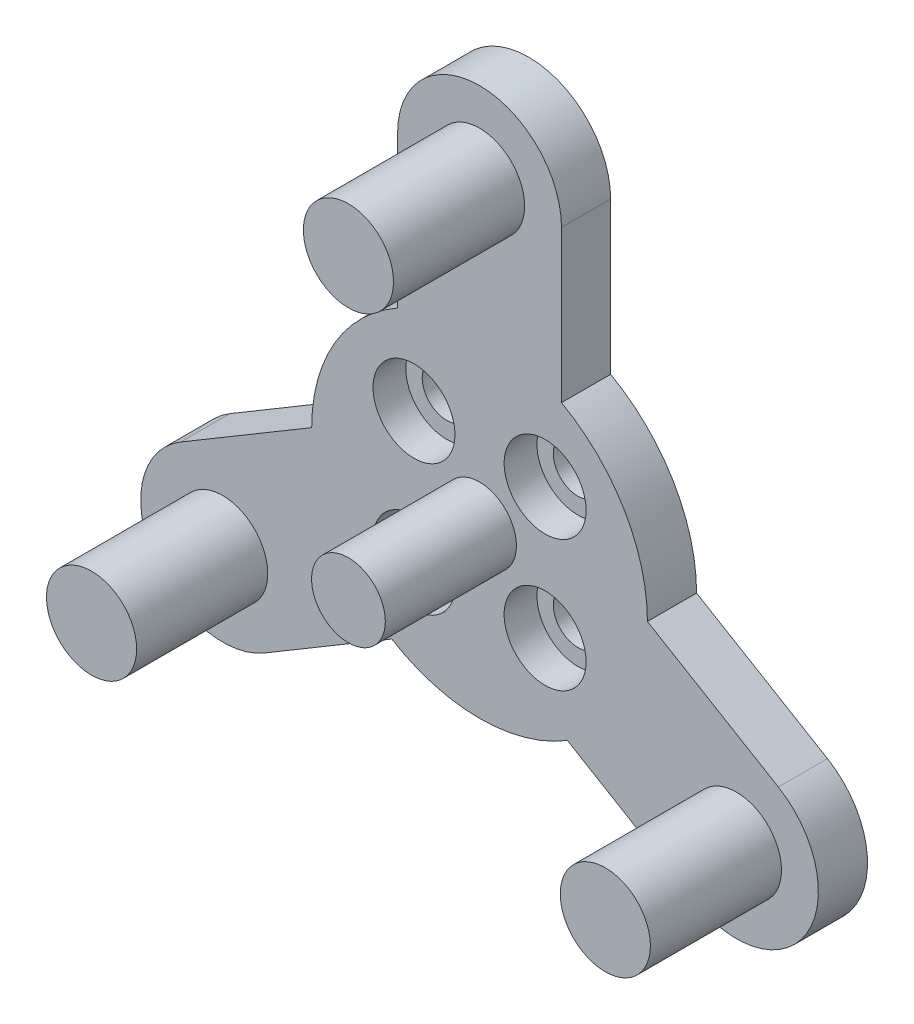
ISO-10303-21;
HEADER;
FILE_DESCRIPTION(('STEP AP214'),'2;1');
FILE_NAME('part.step','',(''),(''),'','','');
FILE_SCHEMA(('AUTOMOTIVE_DESIGN { 1 0 10303 214 1 1 1 1 }'));
ENDSEC;
DATA;
#1=APPLICATION_CONTEXT('core data for automotive mechanical design processes');
#2=APPLICATION_PROTOCOL_DEFINITION('international standard','automotive_design',2000,#1);
#3=PRODUCT_CONTEXT('',#1,'mechanical');
#4=PRODUCT('Part','Part','',(#3));
#5=PRODUCT_RELATED_PRODUCT_CATEGORY('part','',(#4));
#6=PRODUCT_DEFINITION_FORMATION('','',#4);
#7=PRODUCT_DEFINITION_CONTEXT('part definition',#1,'design');
#8=PRODUCT_DEFINITION('design','',#6,#7);
#9=PRODUCT_DEFINITION_SHAPE('','',#8);
#10=(LENGTH_UNIT() NAMED_UNIT(*) SI_UNIT(.MILLI.,.METRE.));
#11=(NAMED_UNIT(*) PLANE_ANGLE_UNIT() SI_UNIT($,.RADIAN.));
#12=(NAMED_UNIT(*) SI_UNIT($,.STERADIAN.) SOLID_ANGLE_UNIT());
#13=UNCERTAINTY_MEASURE_WITH_UNIT(LENGTH_MEASURE(1.E-05),#10,'distance_accuracy_value','');
#14=(GEOMETRIC_REPRESENTATION_CONTEXT(3) GLOBAL_UNCERTAINTY_ASSIGNED_CONTEXT((#13)) GLOBAL_UNIT_ASSIGNED_CONTEXT((#10,
#11,#12)) REPRESENTATION_CONTEXT('',''));
#15=CARTESIAN_POINT('',(0.,0.,0.));
#16=DIRECTION('',(0.,0.,1.));
#17=DIRECTION('',(1.,0.,0.));
#18=AXIS2_PLACEMENT_3D('',#15,#16,#17);
#19=CARTESIAN_POINT('',(4.,4.,10.));
#20=DIRECTION('',(0.,0.,-1.));
#21=DIRECTION('',(-1.,0.,0.));
#22=AXIS2_PLACEMENT_3D('',#19,#20,#21);
#23=CYLINDRICAL_SURFACE('',#22,1.5);
#24=CARTESIAN_POINT('',(4.,4.,0.));
#25=DIRECTION('',(0.,0.,-1.));
#26=DIRECTION('',(-1.,0.,0.));
#27=AXIS2_PLACEMENT_3D('',#24,#25,#26);
#28=CIRCLE('',#27,1.5);
#29=CARTESIAN_POINT('',(2.5,4.,0.));
#30=VERTEX_POINT('',#29);
#31=EDGE_CURVE('E282',#30,#30,#28,.T.);
#32=ORIENTED_EDGE('',*,*,#31,.T.);
#33=EDGE_LOOP('',(#32));
#34=FACE_BOUND('',#33,.T.);
#35=CARTESIAN_POINT('',(4.,4.,0.999999999999999));
#36=DIRECTION('',(0.,0.,1.));
#37=DIRECTION('',(1.,0.,0.));
#38=AXIS2_PLACEMENT_3D('',#35,#36,#37);
#39=CIRCLE('',#38,1.5);
#40=CARTESIAN_POINT('',(5.5,4.,0.999999999999999));
#41=VERTEX_POINT('',#40);
#42=EDGE_CURVE('E90',#41,#41,#39,.F.);
#43=ORIENTED_EDGE('',*,*,#42,.F.);
#44=EDGE_LOOP('',(#43));
#45=FACE_BOUND('',#44,.T.);
#46=ADVANCED_FACE('F86',(#34,#45),#23,.F.);
#47=CARTESIAN_POINT('',(-4.,-4.,10.));
#48=DIRECTION('',(0.,0.,-1.));
#49=DIRECTION('',(-1.,0.,0.));
#50=AXIS2_PLACEMENT_3D('',#47,#48,#49);
#51=CYLINDRICAL_SURFACE('',#50,1.5);
#52=CARTESIAN_POINT('',(-4.,-4.,0.));
#53=DIRECTION('',(0.,0.,-1.));
#54=DIRECTION('',(-1.,0.,0.));
#55=AXIS2_PLACEMENT_3D('',#52,#53,#54);
#56=CIRCLE('',#55,1.5);
#57=CARTESIAN_POINT('',(-5.5,-4.,0.));
#58=VERTEX_POINT('',#57);
#59=EDGE_CURVE('E266',#58,#58,#56,.T.);
#60=ORIENTED_EDGE('',*,*,#59,.T.);
#61=EDGE_LOOP('',(#60));
#62=FACE_BOUND('',#61,.T.);
#63=CARTESIAN_POINT('',(-4.,-4.,0.999999999999999));
#64=DIRECTION('',(0.,0.,1.));
#65=DIRECTION('',(1.,0.,0.));
#66=AXIS2_PLACEMENT_3D('',#63,#64,#65);
#67=CIRCLE('',#66,1.5);
#68=CARTESIAN_POINT('',(-2.5,-4.,0.999999999999999));
#69=VERTEX_POINT('',#68);
#70=EDGE_CURVE('E261',#69,#69,#67,.F.);
#71=ORIENTED_EDGE('',*,*,#70,.F.);
#72=EDGE_LOOP('',(#71));
#73=FACE_BOUND('',#72,.T.);
#74=ADVANCED_FACE('F370',(#62,#73),#51,.F.);
#75=CARTESIAN_POINT('',(4.,-4.,10.));
#76=DIRECTION('',(0.,0.,-1.));
#77=DIRECTION('',(-1.,0.,0.));
#78=AXIS2_PLACEMENT_3D('',#75,#76,#77);
#79=CYLINDRICAL_SURFACE('',#78,1.5);
#80=CARTESIAN_POINT('',(4.,-4.,0.));
#81=DIRECTION('',(0.,0.,-1.));
#82=DIRECTION('',(-1.,0.,0.));
#83=AXIS2_PLACEMENT_3D('',#80,#81,#82);
#84=CIRCLE('',#83,1.5);
#85=CARTESIAN_POINT('',(2.5,-4.,0.));
#86=VERTEX_POINT('',#85);
#87=EDGE_CURVE('E270',#86,#86,#84,.T.);
#88=ORIENTED_EDGE('',*,*,#87,.T.);
#89=EDGE_LOOP('',(#88));
#90=FACE_BOUND('',#89,.T.);
#91=CARTESIAN_POINT('',(4.,-4.,0.999999999999999));
#92=DIRECTION('',(0.,0.,1.));
#93=DIRECTION('',(1.,0.,0.));
#94=AXIS2_PLACEMENT_3D('',#91,#92,#93);
#95=CIRCLE('',#94,1.5);
#96=CARTESIAN_POINT('',(5.5,-4.,0.999999999999999));
#97=VERTEX_POINT('',#96);
#98=EDGE_CURVE('E258',#97,#97,#95,.F.);
#99=ORIENTED_EDGE('',*,*,#98,.F.);
#100=EDGE_LOOP('',(#99));
#101=FACE_BOUND('',#100,.T.);
#102=ADVANCED_FACE('F376',(#90,#101),#79,.F.);
#103=CARTESIAN_POINT('',(-4.,4.,10.));
#104=DIRECTION('',(0.,0.,-1.));
#105=DIRECTION('',(-1.,0.,0.));
#106=AXIS2_PLACEMENT_3D('',#103,#104,#105);
#107=CYLINDRICAL_SURFACE('',#106,1.5);
#108=CARTESIAN_POINT('',(-4.,4.,0.));
#109=DIRECTION('',(0.,0.,-1.));
#110=DIRECTION('',(-1.,0.,0.));
#111=AXIS2_PLACEMENT_3D('',#108,#109,#110);
#112=CIRCLE('',#111,1.5);
#113=CARTESIAN_POINT('',(-5.5,4.,0.));
#114=VERTEX_POINT('',#113);
#115=EDGE_CURVE('E275',#114,#114,#112,.T.);
#116=ORIENTED_EDGE('',*,*,#115,.T.);
#117=EDGE_LOOP('',(#116));
#118=FACE_BOUND('',#117,.T.);
#119=CARTESIAN_POINT('',(-4.,4.,0.999999999999999));
#120=DIRECTION('',(0.,0.,1.));
#121=DIRECTION('',(1.,0.,0.));
#122=AXIS2_PLACEMENT_3D('',#119,#120,#121);
#123=CIRCLE('',#122,1.5);
#124=CARTESIAN_POINT('',(-2.5,4.,0.999999999999999));
#125=VERTEX_POINT('',#124);
#126=EDGE_CURVE('E255',#125,#125,#123,.F.);
#127=ORIENTED_EDGE('',*,*,#126,.F.);
#128=EDGE_LOOP('',(#127));
#129=FACE_BOUND('',#128,.T.);
#130=ADVANCED_FACE('F591',(#118,#129),#107,.F.);
#131=CARTESIAN_POINT('',(-15.6750598084983,-9.05000000000008,3.));
#132=DIRECTION('',(0.,0.,-1.));
#133=DIRECTION('',(-1.,0.,0.));
#134=AXIS2_PLACEMENT_3D('',#131,#132,#133);
#135=CYLINDRICAL_SURFACE('',#134,5.);
#136=CARTESIAN_POINT('',(-15.6750598084983,-9.05000000000008,0.));
#137=DIRECTION('',(0.,0.,1.));
#138=DIRECTION('',(1.,0.,0.));
#139=AXIS2_PLACEMENT_3D('',#136,#137,#138);
#140=CIRCLE('',#139,5.);
#141=CARTESIAN_POINT('',(-18.2317713929619,-4.75311439832654,0.));
#142=VERTEX_POINT('',#141);
#143=CARTESIAN_POINT('',(-13.1183482240346,-13.3468856016736,0.));
#144=VERTEX_POINT('',#143);
#145=EDGE_CURVE('E210',#142,#144,#140,.T.);
#146=ORIENTED_EDGE('',*,*,#145,.T.);
#147=DIRECTION('',(0.,0.,-1.));
#148=VECTOR('',#147,1.);
#149=CARTESIAN_POINT('',(-13.1183482240346,-13.3468856016736,3.));
#150=LINE('',#149,#148);
#151=CARTESIAN_POINT('',(-13.1183482240346,-13.3468856016736,3.));
#152=VERTEX_POINT('',#151);
#153=EDGE_CURVE('E96',#152,#144,#150,.T.);
#154=ORIENTED_EDGE('',*,*,#153,.F.);
#155=CARTESIAN_POINT('',(-15.6750598084983,-9.05000000000008,3.));
#156=DIRECTION('',(0.,0.,1.));
#157=DIRECTION('',(1.,0.,0.));
#158=AXIS2_PLACEMENT_3D('',#155,#156,#157);
#159=CIRCLE('',#158,5.);
#160=CARTESIAN_POINT('',(-18.2317713929619,-4.75311439832654,3.));
#161=VERTEX_POINT('',#160);
#162=EDGE_CURVE('E311',#161,#152,#159,.T.);
#163=ORIENTED_EDGE('',*,*,#162,.F.);
#164=DIRECTION('',(0.,0.,-1.));
#165=VECTOR('',#164,1.);
#166=CARTESIAN_POINT('',(-18.2317713929619,-4.75311439832654,3.));
#167=LINE('',#166,#165);
#168=EDGE_CURVE('E12',#161,#142,#167,.T.);
#169=ORIENTED_EDGE('',*,*,#168,.T.);
#170=EDGE_LOOP('',(#146,#154,#163,#169));
#171=FACE_BOUND('',#170,.T.);
#172=ADVANCED_FACE('F342',(#171),#135,.T.);
#173=CARTESIAN_POINT('',(2.43503335375282,-4.09238954480285,3.));
#174=DIRECTION('',(-0.511342316892728,0.859377120334709,0.));
#175=DIRECTION('',(-0.859377120334709,-0.511342316892728,0.));
#176=AXIS2_PLACEMENT_3D('',#173,#174,#175);
#177=PLANE('',#176);
#178=DIRECTION('',(0.859377120334709,0.511342316892728,0.));
#179=VECTOR('',#178,1.);
#180=CARTESIAN_POINT('',(2.43503335375282,-4.09238954480285,0.));
#181=LINE('',#180,#179);
#182=CARTESIAN_POINT('',(-5.35896242928677,-8.72993430512808,0.));
#183=VERTEX_POINT('',#182);
#184=EDGE_CURVE('E213',#144,#183,#181,.T.);
#185=ORIENTED_EDGE('',*,*,#184,.T.);
#186=DIRECTION('',(0.,0.,-1.));
#187=VECTOR('',#186,1.);
#188=CARTESIAN_POINT('',(-5.35896242928677,-8.72993430512808,3.));
#189=LINE('',#188,#187);
#190=CARTESIAN_POINT('',(-5.35896242928677,-8.72993430512808,3.));
#191=VERTEX_POINT('',#190);
#192=EDGE_CURVE('E244',#191,#183,#189,.T.);
#193=ORIENTED_EDGE('',*,*,#192,.F.);
#194=DIRECTION('',(0.859377120334709,0.511342316892728,0.));
#195=VECTOR('',#194,1.);
#196=CARTESIAN_POINT('',(2.43503335375282,-4.09238954480285,3.));
#197=LINE('',#196,#195);
#198=EDGE_CURVE('E313',#152,#191,#197,.T.);
#199=ORIENTED_EDGE('',*,*,#198,.F.);
#200=ORIENTED_EDGE('',*,*,#153,.T.);
#201=EDGE_LOOP('',(#185,#193,#199,#200));
#202=FACE_BOUND('',#201,.T.);
#203=ADVANCED_FACE('F345',(#202),#177,.F.);
#204=CARTESIAN_POINT('',(0.,0.,3.));
#205=DIRECTION('',(0.,0.,-1.));
#206=DIRECTION('',(-1.,0.,0.));
#207=AXIS2_PLACEMENT_3D('',#204,#205,#206);
#208=CYLINDRICAL_SURFACE('',#207,10.2435458358109);
#209=CARTESIAN_POINT('',(0.,0.,0.));
#210=DIRECTION('',(0.,0.,1.));
#211=DIRECTION('',(1.,0.,0.));
#212=AXIS2_PLACEMENT_3D('',#209,#210,#211);
#213=CIRCLE('',#212,10.2435458358109);
#214=CARTESIAN_POINT('',(5.35896242928677,-8.72993430512809,0.));
#215=VERTEX_POINT('',#214);
#216=EDGE_CURVE('E215',#183,#215,#213,.T.);
#217=ORIENTED_EDGE('',*,*,#216,.T.);
#218=DIRECTION('',(0.,0.,-1.));
#219=VECTOR('',#218,1.);
#220=CARTESIAN_POINT('',(5.35896242928677,-8.72993430512809,3.));
#221=LINE('',#220,#219);
#222=CARTESIAN_POINT('',(5.35896242928677,-8.72993430512809,3.));
#223=VERTEX_POINT('',#222);
#224=EDGE_CURVE('E242',#223,#215,#221,.T.);
#225=ORIENTED_EDGE('',*,*,#224,.F.);
#226=CARTESIAN_POINT('',(0.,0.,3.));
#227=DIRECTION('',(0.,0.,1.));
#228=DIRECTION('',(1.,0.,0.));
#229=AXIS2_PLACEMENT_3D('',#226,#227,#228);
#230=CIRCLE('',#229,10.2435458358109);
#231=EDGE_CURVE('E204',#191,#223,#230,.T.);
#232=ORIENTED_EDGE('',*,*,#231,.F.);
#233=ORIENTED_EDGE('',*,*,#192,.T.);
#234=EDGE_LOOP('',(#217,#225,#232,#233));
#235=FACE_BOUND('',#234,.T.);
#236=ADVANCED_FACE('F350',(#235),#208,.T.);
#237=CARTESIAN_POINT('',(-2.43503335375282,-4.09238954480286,3.));
#238=DIRECTION('',(-0.511342316892728,-0.859377120334709,0.));
#239=DIRECTION('',(0.859377120334709,-0.511342316892728,0.));
#240=AXIS2_PLACEMENT_3D('',#237,#238,#239);
#241=PLANE('',#240);
#242=DIRECTION('',(-0.859377120334709,0.511342316892728,0.));
#243=VECTOR('',#242,1.);
#244=CARTESIAN_POINT('',(-2.43503335375282,-4.09238954480286,0.));
#245=LINE('',#244,#243);
#246=CARTESIAN_POINT('',(13.1183482240346,-13.3468856016736,0.));
#247=VERTEX_POINT('',#246);
#248=EDGE_CURVE('E218',#247,#215,#245,.T.);
#249=ORIENTED_EDGE('',*,*,#248,.F.);
#250=DIRECTION('',(0.,0.,-1.));
#251=VECTOR('',#250,1.);
#252=CARTESIAN_POINT('',(13.1183482240346,-13.3468856016736,3.));
#253=LINE('',#252,#251);
#254=CARTESIAN_POINT('',(13.1183482240346,-13.3468856016736,3.));
#255=VERTEX_POINT('',#254);
#256=EDGE_CURVE('E240',#255,#247,#253,.T.);
#257=ORIENTED_EDGE('',*,*,#256,.F.);
#258=DIRECTION('',(-0.859377120334709,0.511342316892728,0.));
#259=VECTOR('',#258,1.);
#260=CARTESIAN_POINT('',(-2.43503335375282,-4.09238954480286,3.));
#261=LINE('',#260,#259);
#262=EDGE_CURVE('E315',#255,#223,#261,.T.);
#263=ORIENTED_EDGE('',*,*,#262,.T.);
#264=ORIENTED_EDGE('',*,*,#224,.T.);
#265=EDGE_LOOP('',(#249,#257,#263,#264));
#266=FACE_BOUND('',#265,.T.);
#267=ADVANCED_FACE('F355',(#266),#241,.T.);
#268=CARTESIAN_POINT('',(2.67838981517445,4.50138165854423,3.));
#269=DIRECTION('',(-0.511342316892728,-0.859377120334709,0.));
#270=DIRECTION('',(0.859377120334709,-0.511342316892728,0.));
#271=AXIS2_PLACEMENT_3D('',#268,#269,#270);
#272=PLANE('',#271);
#273=DIRECTION('',(-0.859377120334709,0.511342316892728,0.));
#274=VECTOR('',#273,1.);
#275=CARTESIAN_POINT('',(2.67838981517445,4.50138165854423,0.));
#276=LINE('',#275,#274);
#277=CARTESIAN_POINT('',(18.2317713929619,-4.75311439832654,0.));
#278=VERTEX_POINT('',#277);
#279=CARTESIAN_POINT('',(10.2435458358109,0.,0.));
#280=VERTEX_POINT('',#279);
#281=EDGE_CURVE('E223',#278,#280,#276,.T.);
#282=ORIENTED_EDGE('',*,*,#281,.T.);
#283=DIRECTION('',(0.,0.,-1.));
#284=VECTOR('',#283,1.);
#285=CARTESIAN_POINT('',(10.2435458358109,0.,3.));
#286=LINE('',#285,#284);
#287=CARTESIAN_POINT('',(10.2435458358109,0.,3.));
#288=VERTEX_POINT('',#287);
#289=EDGE_CURVE('E235',#288,#280,#286,.T.);
#290=ORIENTED_EDGE('',*,*,#289,.F.);
#291=DIRECTION('',(-0.859377120334709,0.511342316892728,0.));
#292=VECTOR('',#291,1.);
#293=CARTESIAN_POINT('',(2.67838981517445,4.50138165854423,3.));
#294=LINE('',#293,#292);
#295=CARTESIAN_POINT('',(18.2317713929619,-4.75311439832654,3.));
#296=VERTEX_POINT('',#295);
#297=EDGE_CURVE('E318',#296,#288,#294,.T.);
#298=ORIENTED_EDGE('',*,*,#297,.F.);
#299=DIRECTION('',(0.,0.,-1.));
#300=VECTOR('',#299,1.);
#301=CARTESIAN_POINT('',(18.2317713929619,-4.75311439832654,3.));
#302=LINE('',#301,#300);
#303=EDGE_CURVE('E238',#296,#278,#302,.T.);
#304=ORIENTED_EDGE('',*,*,#303,.T.);
#305=EDGE_LOOP('',(#282,#290,#298,#304));
#306=FACE_BOUND('',#305,.T.);
#307=ADVANCED_FACE('F359',(#306),#272,.F.);
#308=CARTESIAN_POINT('',(5.,8.94037086984423,0.));
#309=VERTEX_POINT('',#308);
#310=EDGE_CURVE('E220',#280,#309,#213,.T.);
#311=ORIENTED_EDGE('',*,*,#310,.T.);
#312=DIRECTION('',(0.,0.,-1.));
#313=VECTOR('',#312,1.);
#314=CARTESIAN_POINT('',(5.,8.94037086984423,3.));
#315=LINE('',#314,#313);
#316=CARTESIAN_POINT('',(5.,8.94037086984423,3.));
#317=VERTEX_POINT('',#316);
#318=EDGE_CURVE('E233',#317,#309,#315,.T.);
#319=ORIENTED_EDGE('',*,*,#318,.F.);
#320=EDGE_CURVE('E203',#288,#317,#230,.T.);
#321=ORIENTED_EDGE('',*,*,#320,.F.);
#322=ORIENTED_EDGE('',*,*,#289,.T.);
#323=EDGE_LOOP('',(#311,#319,#321,#322));
#324=FACE_BOUND('',#323,.T.);
#325=ADVANCED_FACE('F326',(#324),#208,.T.);
#326=CARTESIAN_POINT('',(5.,0.,3.));
#327=DIRECTION('',(1.,0.,0.));
#328=DIRECTION('',(0.,1.,0.));
#329=AXIS2_PLACEMENT_3D('',#326,#327,#328);
#330=PLANE('',#329);
#331=DIRECTION('',(0.,-1.,0.));
#332=VECTOR('',#331,1.);
#333=CARTESIAN_POINT('',(5.,0.,0.));
#334=LINE('',#333,#332);
#335=CARTESIAN_POINT('',(5.,18.2,0.));
#336=VERTEX_POINT('',#335);
#337=EDGE_CURVE('E225',#336,#309,#334,.T.);
#338=ORIENTED_EDGE('',*,*,#337,.F.);
#339=DIRECTION('',(0.,0.,-1.));
#340=VECTOR('',#339,1.);
#341=CARTESIAN_POINT('',(5.,18.2,3.));
#342=LINE('',#341,#340);
#343=CARTESIAN_POINT('',(5.,18.2,3.));
#344=VERTEX_POINT('',#343);
#345=EDGE_CURVE('E197',#344,#336,#342,.T.);
#346=ORIENTED_EDGE('',*,*,#345,.F.);
#347=DIRECTION('',(0.,-1.,0.));
#348=VECTOR('',#347,1.);
#349=CARTESIAN_POINT('',(5.,0.,3.));
#350=LINE('',#349,#348);
#351=EDGE_CURVE('E190',#344,#317,#350,.T.);
#352=ORIENTED_EDGE('',*,*,#351,.T.);
#353=ORIENTED_EDGE('',*,*,#318,.T.);
#354=EDGE_LOOP('',(#338,#346,#352,#353));
#355=FACE_BOUND('',#354,.T.);
#356=ADVANCED_FACE('F329',(#355),#330,.T.);
#357=CARTESIAN_POINT('',(0.,18.2,3.));
#358=DIRECTION('',(0.,0.,-1.));
#359=DIRECTION('',(-1.,0.,0.));
#360=AXIS2_PLACEMENT_3D('',#357,#358,#359);
#361=CYLINDRICAL_SURFACE('',#360,5.);
#362=CARTESIAN_POINT('',(0.,18.2,0.));
#363=DIRECTION('',(0.,0.,1.));
#364=DIRECTION('',(1.,0.,0.));
#365=AXIS2_PLACEMENT_3D('',#362,#363,#364);
#366=CIRCLE('',#365,5.);
#367=CARTESIAN_POINT('',(-5.,18.2,0.));
#368=VERTEX_POINT('',#367);
#369=EDGE_CURVE('E196',#336,#368,#366,.T.);
#370=ORIENTED_EDGE('',*,*,#369,.T.);
#371=DIRECTION('',(0.,0.,-1.));
#372=VECTOR('',#371,1.);
#373=CARTESIAN_POINT('',(-5.,18.2,3.));
#374=LINE('',#373,#372);
#375=CARTESIAN_POINT('',(-5.,18.2,3.));
#376=VERTEX_POINT('',#375);
#377=EDGE_CURVE('E193',#376,#368,#374,.T.);
#378=ORIENTED_EDGE('',*,*,#377,.F.);
#379=CARTESIAN_POINT('',(0.,18.2,3.));
#380=DIRECTION('',(0.,0.,1.));
#381=DIRECTION('',(1.,0.,0.));
#382=AXIS2_PLACEMENT_3D('',#379,#380,#381);
#383=CIRCLE('',#382,5.);
#384=EDGE_CURVE('E184',#344,#376,#383,.T.);
#385=ORIENTED_EDGE('',*,*,#384,.F.);
#386=ORIENTED_EDGE('',*,*,#345,.T.);
#387=EDGE_LOOP('',(#370,#378,#385,#386));
#388=FACE_BOUND('',#387,.T.);
#389=ADVANCED_FACE('F194',(#388),#361,.T.);
#390=CARTESIAN_POINT('',(-5.,0.,3.));
#391=DIRECTION('',(1.,0.,0.));
#392=DIRECTION('',(0.,1.,0.));
#393=AXIS2_PLACEMENT_3D('',#390,#391,#392);
#394=PLANE('',#393);
#395=DIRECTION('',(0.,-1.,0.));
#396=VECTOR('',#395,1.);
#397=CARTESIAN_POINT('',(-5.,0.,0.));
#398=LINE('',#397,#396);
#399=CARTESIAN_POINT('',(-5.,8.94037086984424,0.));
#400=VERTEX_POINT('',#399);
#401=EDGE_CURVE('E145',#368,#400,#398,.T.);
#402=ORIENTED_EDGE('',*,*,#401,.T.);
#403=DIRECTION('',(0.,0.,-1.));
#404=VECTOR('',#403,1.);
#405=CARTESIAN_POINT('',(-5.,8.94037086984424,3.));
#406=LINE('',#405,#404);
#407=CARTESIAN_POINT('',(-5.,8.94037086984424,3.));
#408=VERTEX_POINT('',#407);
#409=EDGE_CURVE('E198',#408,#400,#406,.T.);
#410=ORIENTED_EDGE('',*,*,#409,.F.);
#411=DIRECTION('',(0.,-1.,0.));
#412=VECTOR('',#411,1.);
#413=CARTESIAN_POINT('',(-5.,0.,3.));
#414=LINE('',#413,#412);
#415=EDGE_CURVE('E188',#376,#408,#414,.T.);
#416=ORIENTED_EDGE('',*,*,#415,.F.);
#417=ORIENTED_EDGE('',*,*,#377,.T.);
#418=EDGE_LOOP('',(#402,#410,#416,#417));
#419=FACE_BOUND('',#418,.T.);
#420=ADVANCED_FACE('F200',(#419),#394,.F.);
#421=CARTESIAN_POINT('',(-10.2435458358109,0.,0.));
#422=VERTEX_POINT('',#421);
#423=EDGE_CURVE('E219',#400,#422,#213,.T.);
#424=ORIENTED_EDGE('',*,*,#423,.T.);
#425=DIRECTION('',(0.,0.,-1.));
#426=VECTOR('',#425,1.);
#427=CARTESIAN_POINT('',(-10.2435458358109,0.,3.));
#428=LINE('',#427,#426);
#429=CARTESIAN_POINT('',(-10.2435458358109,0.,3.));
#430=VERTEX_POINT('',#429);
#431=EDGE_CURVE('E152',#430,#422,#428,.T.);
#432=ORIENTED_EDGE('',*,*,#431,.F.);
#433=EDGE_CURVE('E105',#408,#430,#230,.T.);
#434=ORIENTED_EDGE('',*,*,#433,.F.);
#435=ORIENTED_EDGE('',*,*,#409,.T.);
#436=EDGE_LOOP('',(#424,#432,#434,#435));
#437=FACE_BOUND('',#436,.T.);
#438=ADVANCED_FACE('F336',(#437),#208,.T.);
#439=CARTESIAN_POINT('',(-2.67838981517446,4.50138165854424,3.));
#440=DIRECTION('',(-0.511342316892728,0.859377120334709,0.));
#441=DIRECTION('',(-0.859377120334709,-0.511342316892728,0.));
#442=AXIS2_PLACEMENT_3D('',#439,#440,#441);
#443=PLANE('',#442);
#444=DIRECTION('',(0.859377120334709,0.511342316892728,0.));
#445=VECTOR('',#444,1.);
#446=CARTESIAN_POINT('',(-2.67838981517446,4.50138165854424,0.));
#447=LINE('',#446,#445);
#448=EDGE_CURVE('E207',#142,#422,#447,.T.);
#449=ORIENTED_EDGE('',*,*,#448,.F.);
#450=ORIENTED_EDGE('',*,*,#168,.F.);
#451=DIRECTION('',(0.859377120334709,0.511342316892728,0.));
#452=VECTOR('',#451,1.);
#453=CARTESIAN_POINT('',(-2.67838981517446,4.50138165854424,3.));
#454=LINE('',#453,#452);
#455=EDGE_CURVE('E309',#161,#430,#454,.T.);
#456=ORIENTED_EDGE('',*,*,#455,.T.);
#457=ORIENTED_EDGE('',*,*,#431,.T.);
#458=EDGE_LOOP('',(#449,#450,#456,#457));
#459=FACE_BOUND('',#458,.T.);
#460=ADVANCED_FACE('F337',(#459),#443,.T.);
#461=CARTESIAN_POINT('',(0.,0.,0.));
#462=DIRECTION('',(0.,0.,1.));
#463=DIRECTION('',(1.,0.,0.));
#464=AXIS2_PLACEMENT_3D('',#461,#462,#463);
#465=PLANE('',#464);
#466=ORIENTED_EDGE('',*,*,#115,.F.);
#467=EDGE_LOOP('',(#466));
#468=FACE_BOUND('',#467,.T.);
#469=ORIENTED_EDGE('',*,*,#87,.F.);
#470=EDGE_LOOP('',(#469));
#471=FACE_BOUND('',#470,.T.);
#472=ORIENTED_EDGE('',*,*,#59,.F.);
#473=EDGE_LOOP('',(#472));
#474=FACE_BOUND('',#473,.T.);
#475=ORIENTED_EDGE('',*,*,#31,.F.);
#476=EDGE_LOOP('',(#475));
#477=FACE_BOUND('',#476,.T.);
#478=ORIENTED_EDGE('',*,*,#448,.T.);
#479=ORIENTED_EDGE('',*,*,#423,.F.);
#480=ORIENTED_EDGE('',*,*,#401,.F.);
#481=ORIENTED_EDGE('',*,*,#369,.F.);
#482=ORIENTED_EDGE('',*,*,#337,.T.);
#483=ORIENTED_EDGE('',*,*,#310,.F.);
#484=ORIENTED_EDGE('',*,*,#281,.F.);
#485=CARTESIAN_POINT('',(15.6750598084983,-9.05000000000008,0.));
#486=DIRECTION('',(0.,0.,1.));
#487=DIRECTION('',(1.,0.,0.));
#488=AXIS2_PLACEMENT_3D('',#485,#486,#487);
#489=CIRCLE('',#488,5.);
#490=EDGE_CURVE('E251',#247,#278,#489,.T.);
#491=ORIENTED_EDGE('',*,*,#490,.F.);
#492=ORIENTED_EDGE('',*,*,#248,.T.);
#493=ORIENTED_EDGE('',*,*,#216,.F.);
#494=ORIENTED_EDGE('',*,*,#184,.F.);
#495=ORIENTED_EDGE('',*,*,#145,.F.);
#496=EDGE_LOOP('',(#478,#479,#480,#481,#482,#483,#484,#491,#492,#493,#494,#495));
#497=FACE_BOUND('',#496,.T.);
#498=ADVANCED_FACE('F331',(#468,#471,#474,#477,#497),#465,.F.);
#499=CARTESIAN_POINT('',(0.,0.,3.));
#500=DIRECTION('',(0.,0.,1.));
#501=DIRECTION('',(1.,0.,0.));
#502=AXIS2_PLACEMENT_3D('',#499,#500,#501);
#503=PLANE('',#502);
#504=CARTESIAN_POINT('',(-4.,-4.,3.));
#505=DIRECTION('',(0.,0.,1.));
#506=DIRECTION('',(1.,0.,0.));
#507=AXIS2_PLACEMENT_3D('',#504,#505,#506);
#508=CIRCLE('',#507,2.5);
#509=CARTESIAN_POINT('',(-1.5,-4.,3.));
#510=VERTEX_POINT('',#509);
#511=EDGE_CURVE('E734',#510,#510,#508,.T.);
#512=ORIENTED_EDGE('',*,*,#511,.F.);
#513=EDGE_LOOP('',(#512));
#514=FACE_BOUND('',#513,.T.);
#515=CARTESIAN_POINT('',(4.,-4.,3.));
#516=DIRECTION('',(0.,0.,1.));
#517=DIRECTION('',(1.,0.,0.));
#518=AXIS2_PLACEMENT_3D('',#515,#516,#517);
#519=CIRCLE('',#518,2.5);
#520=CARTESIAN_POINT('',(6.5,-4.,3.));
#521=VERTEX_POINT('',#520);
#522=EDGE_CURVE('E726',#521,#521,#519,.T.);
#523=ORIENTED_EDGE('',*,*,#522,.F.);
#524=EDGE_LOOP('',(#523));
#525=FACE_BOUND('',#524,.T.);
#526=CARTESIAN_POINT('',(4.,4.,3.));
#527=DIRECTION('',(0.,0.,1.));
#528=DIRECTION('',(1.,0.,0.));
#529=AXIS2_PLACEMENT_3D('',#526,#527,#528);
#530=CIRCLE('',#529,2.5);
#531=CARTESIAN_POINT('',(6.5,4.,3.));
#532=VERTEX_POINT('',#531);
#533=EDGE_CURVE('E720',#532,#532,#530,.T.);
#534=ORIENTED_EDGE('',*,*,#533,.F.);
#535=EDGE_LOOP('',(#534));
#536=FACE_BOUND('',#535,.T.);
#537=CARTESIAN_POINT('',(-4.,4.,3.));
#538=DIRECTION('',(0.,0.,1.));
#539=DIRECTION('',(1.,0.,0.));
#540=AXIS2_PLACEMENT_3D('',#537,#538,#539);
#541=CIRCLE('',#540,2.5);
#542=CARTESIAN_POINT('',(-1.5,4.,3.));
#543=VERTEX_POINT('',#542);
#544=EDGE_CURVE('E279',#543,#543,#541,.T.);
#545=ORIENTED_EDGE('',*,*,#544,.F.);
#546=EDGE_LOOP('',(#545));
#547=FACE_BOUND('',#546,.T.);
#548=CARTESIAN_POINT('',(0.,0.,3.));
#549=DIRECTION('',(0.,0.,1.));
#550=DIRECTION('',(1.,0.,0.));
#551=AXIS2_PLACEMENT_3D('',#548,#549,#550);
#552=CIRCLE('',#551,2.25);
#553=CARTESIAN_POINT('',(2.25,0.,3.));
#554=VERTEX_POINT('',#553);
#555=EDGE_CURVE('E286',#554,#554,#552,.T.);
#556=ORIENTED_EDGE('',*,*,#555,.F.);
#557=EDGE_LOOP('',(#556));
#558=FACE_BOUND('',#557,.T.);
#559=CARTESIAN_POINT('',(-15.6750598084983,-9.05000000000008,3.));
#560=DIRECTION('',(0.,0.,1.));
#561=DIRECTION('',(1.,0.,0.));
#562=AXIS2_PLACEMENT_3D('',#559,#560,#561);
#563=CIRCLE('',#562,2.75);
#564=CARTESIAN_POINT('',(-12.9250598084983,-9.05000000000008,3.));
#565=VERTEX_POINT('',#564);
#566=EDGE_CURVE('E290',#565,#565,#563,.T.);
#567=ORIENTED_EDGE('',*,*,#566,.F.);
#568=EDGE_LOOP('',(#567));
#569=FACE_BOUND('',#568,.T.);
#570=CARTESIAN_POINT('',(15.6750598084983,-9.05000000000008,3.));
#571=DIRECTION('',(0.,0.,1.));
#572=DIRECTION('',(1.,0.,0.));
#573=AXIS2_PLACEMENT_3D('',#570,#571,#572);
#574=CIRCLE('',#573,2.75);
#575=CARTESIAN_POINT('',(18.4250598084983,-9.05000000000008,3.));
#576=VERTEX_POINT('',#575);
#577=EDGE_CURVE('E296',#576,#576,#574,.T.);
#578=ORIENTED_EDGE('',*,*,#577,.F.);
#579=EDGE_LOOP('',(#578));
#580=FACE_BOUND('',#579,.T.);
#581=CARTESIAN_POINT('',(0.,18.2,3.));
#582=DIRECTION('',(0.,0.,1.));
#583=DIRECTION('',(1.,0.,0.));
#584=AXIS2_PLACEMENT_3D('',#581,#582,#583);
#585=CIRCLE('',#584,2.75);
#586=CARTESIAN_POINT('',(2.75,18.2,3.));
#587=VERTEX_POINT('',#586);
#588=EDGE_CURVE('E302',#587,#587,#585,.T.);
#589=ORIENTED_EDGE('',*,*,#588,.F.);
#590=EDGE_LOOP('',(#589));
#591=FACE_BOUND('',#590,.T.);
#592=ORIENTED_EDGE('',*,*,#455,.F.);
#593=ORIENTED_EDGE('',*,*,#162,.T.);
#594=ORIENTED_EDGE('',*,*,#198,.T.);
#595=ORIENTED_EDGE('',*,*,#231,.T.);
#596=ORIENTED_EDGE('',*,*,#262,.F.);
#597=CARTESIAN_POINT('',(15.6750598084983,-9.05000000000008,3.));
#598=DIRECTION('',(0.,0.,1.));
#599=DIRECTION('',(1.,0.,0.));
#600=AXIS2_PLACEMENT_3D('',#597,#598,#599);
#601=CIRCLE('',#600,5.);
#602=EDGE_CURVE('E211',#255,#296,#601,.T.);
#603=ORIENTED_EDGE('',*,*,#602,.T.);
#604=ORIENTED_EDGE('',*,*,#297,.T.);
#605=ORIENTED_EDGE('',*,*,#320,.T.);
#606=ORIENTED_EDGE('',*,*,#351,.F.);
#607=ORIENTED_EDGE('',*,*,#384,.T.);
#608=ORIENTED_EDGE('',*,*,#415,.T.);
#609=ORIENTED_EDGE('',*,*,#433,.T.);
#610=EDGE_LOOP('',(#592,#593,#594,#595,#596,#603,#604,#605,#606,#607,#608,#609));
#611=FACE_BOUND('',#610,.T.);
#612=ADVANCED_FACE('F186',(#514,#525,#536,#547,#558,#569,#580,#591,#611),#503,.T.);
#613=CARTESIAN_POINT('',(15.6750598084983,-9.05000000000008,3.));
#614=DIRECTION('',(0.,0.,-1.));
#615=DIRECTION('',(-1.,0.,0.));
#616=AXIS2_PLACEMENT_3D('',#613,#614,#615);
#617=CYLINDRICAL_SURFACE('',#616,5.);
#618=ORIENTED_EDGE('',*,*,#256,.T.);
#619=ORIENTED_EDGE('',*,*,#490,.T.);
#620=ORIENTED_EDGE('',*,*,#303,.F.);
#621=ORIENTED_EDGE('',*,*,#602,.F.);
#622=EDGE_LOOP('',(#618,#619,#620,#621));
#623=FACE_BOUND('',#622,.T.);
#624=ADVANCED_FACE('F88',(#623),#617,.T.);
#625=CARTESIAN_POINT('',(0.,18.2,11.));
#626=DIRECTION('',(0.,0.,-1.));
#627=DIRECTION('',(-1.,0.,0.));
#628=AXIS2_PLACEMENT_3D('',#625,#626,#627);
#629=CYLINDRICAL_SURFACE('',#628,2.75);
#630=CARTESIAN_POINT('',(0.,18.2,11.));
#631=DIRECTION('',(0.,0.,1.));
#632=DIRECTION('',(1.,0.,0.));
#633=AXIS2_PLACEMENT_3D('',#630,#631,#632);
#634=CIRCLE('',#633,2.75);
#635=CARTESIAN_POINT('',(2.75,18.2,11.));
#636=VERTEX_POINT('',#635);
#637=EDGE_CURVE('E254',#636,#636,#634,.T.);
#638=ORIENTED_EDGE('',*,*,#637,.F.);
#639=EDGE_LOOP('',(#638));
#640=FACE_BOUND('',#639,.T.);
#641=ORIENTED_EDGE('',*,*,#588,.T.);
#642=EDGE_LOOP('',(#641));
#643=FACE_BOUND('',#642,.T.);
#644=ADVANCED_FACE('F410',(#640,#643),#629,.T.);
#645=CARTESIAN_POINT('',(0.,18.2,11.));
#646=DIRECTION('',(0.,0.,1.));
#647=DIRECTION('',(1.,0.,0.));
#648=AXIS2_PLACEMENT_3D('',#645,#646,#647);
#649=PLANE('',#648);
#650=ORIENTED_EDGE('',*,*,#637,.T.);
#651=EDGE_LOOP('',(#650));
#652=FACE_BOUND('',#651,.T.);
#653=ADVANCED_FACE('F406',(#652),#649,.T.);
#654=CARTESIAN_POINT('',(15.6750598084983,-9.05000000000008,11.));
#655=DIRECTION('',(0.,0.,-1.));
#656=DIRECTION('',(-1.,0.,0.));
#657=AXIS2_PLACEMENT_3D('',#654,#655,#656);
#658=CYLINDRICAL_SURFACE('',#657,2.75);
#659=CARTESIAN_POINT('',(15.6750598084983,-9.05000000000008,11.));
#660=DIRECTION('',(0.,0.,1.));
#661=DIRECTION('',(1.,0.,0.));
#662=AXIS2_PLACEMENT_3D('',#659,#660,#661);
#663=CIRCLE('',#662,2.75);
#664=CARTESIAN_POINT('',(18.4250598084983,-9.05000000000008,11.));
#665=VERTEX_POINT('',#664);
#666=EDGE_CURVE('E299',#665,#665,#663,.T.);
#667=ORIENTED_EDGE('',*,*,#666,.F.);
#668=EDGE_LOOP('',(#667));
#669=FACE_BOUND('',#668,.T.);
#670=ORIENTED_EDGE('',*,*,#577,.T.);
#671=EDGE_LOOP('',(#670));
#672=FACE_BOUND('',#671,.T.);
#673=ADVANCED_FACE('F402',(#669,#672),#658,.T.);
#674=CARTESIAN_POINT('',(15.6750598084983,-9.05000000000008,11.));
#675=DIRECTION('',(0.,0.,1.));
#676=DIRECTION('',(1.,0.,0.));
#677=AXIS2_PLACEMENT_3D('',#674,#675,#676);
#678=PLANE('',#677);
#679=ORIENTED_EDGE('',*,*,#666,.T.);
#680=EDGE_LOOP('',(#679));
#681=FACE_BOUND('',#680,.T.);
#682=ADVANCED_FACE('F398',(#681),#678,.T.);
#683=CARTESIAN_POINT('',(-15.6750598084983,-9.05000000000008,11.));
#684=DIRECTION('',(0.,0.,-1.));
#685=DIRECTION('',(-1.,0.,0.));
#686=AXIS2_PLACEMENT_3D('',#683,#684,#685);
#687=CYLINDRICAL_SURFACE('',#686,2.75);
#688=CARTESIAN_POINT('',(-15.6750598084983,-9.05000000000008,11.));
#689=DIRECTION('',(0.,0.,1.));
#690=DIRECTION('',(1.,0.,0.));
#691=AXIS2_PLACEMENT_3D('',#688,#689,#690);
#692=CIRCLE('',#691,2.75);
#693=CARTESIAN_POINT('',(-12.9250598084983,-9.05000000000008,11.));
#694=VERTEX_POINT('',#693);
#695=EDGE_CURVE('E293',#694,#694,#692,.T.);
#696=ORIENTED_EDGE('',*,*,#695,.F.);
#697=EDGE_LOOP('',(#696));
#698=FACE_BOUND('',#697,.T.);
#699=ORIENTED_EDGE('',*,*,#566,.T.);
#700=EDGE_LOOP('',(#699));
#701=FACE_BOUND('',#700,.T.);
#702=ADVANCED_FACE('F394',(#698,#701),#687,.T.);
#703=CARTESIAN_POINT('',(-15.6750598084983,-9.05000000000008,11.));
#704=DIRECTION('',(0.,0.,1.));
#705=DIRECTION('',(1.,0.,0.));
#706=AXIS2_PLACEMENT_3D('',#703,#704,#705);
#707=PLANE('',#706);
#708=ORIENTED_EDGE('',*,*,#695,.T.);
#709=EDGE_LOOP('',(#708));
#710=FACE_BOUND('',#709,.T.);
#711=ADVANCED_FACE('F390',(#710),#707,.T.);
#712=CARTESIAN_POINT('',(0.,0.,11.));
#713=DIRECTION('',(0.,0.,-1.));
#714=DIRECTION('',(-1.,0.,0.));
#715=AXIS2_PLACEMENT_3D('',#712,#713,#714);
#716=CYLINDRICAL_SURFACE('',#715,2.25);
#717=CARTESIAN_POINT('',(0.,0.,11.));
#718=DIRECTION('',(0.,0.,1.));
#719=DIRECTION('',(1.,0.,0.));
#720=AXIS2_PLACEMENT_3D('',#717,#718,#719);
#721=CIRCLE('',#720,2.25);
#722=CARTESIAN_POINT('',(2.25,0.,11.));
#723=VERTEX_POINT('',#722);
#724=EDGE_CURVE('E287',#723,#723,#721,.T.);
#725=ORIENTED_EDGE('',*,*,#724,.F.);
#726=EDGE_LOOP('',(#725));
#727=FACE_BOUND('',#726,.T.);
#728=ORIENTED_EDGE('',*,*,#555,.T.);
#729=EDGE_LOOP('',(#728));
#730=FACE_BOUND('',#729,.T.);
#731=ADVANCED_FACE('F386',(#727,#730),#716,.T.);
#732=CARTESIAN_POINT('',(0.,0.,11.));
#733=DIRECTION('',(0.,0.,1.));
#734=DIRECTION('',(1.,0.,0.));
#735=AXIS2_PLACEMENT_3D('',#732,#733,#734);
#736=PLANE('',#735);
#737=ORIENTED_EDGE('',*,*,#724,.T.);
#738=EDGE_LOOP('',(#737));
#739=FACE_BOUND('',#738,.T.);
#740=ADVANCED_FACE('F382',(#739),#736,.T.);
#741=CARTESIAN_POINT('',(-4.,4.,1.));
#742=DIRECTION('',(0.,0.,1.));
#743=DIRECTION('',(1.,0.,0.));
#744=AXIS2_PLACEMENT_3D('',#741,#742,#743);
#745=PLANE('',#744);
#746=CARTESIAN_POINT('',(-4.,4.,1.));
#747=DIRECTION('',(0.,0.,1.));
#748=DIRECTION('',(1.,0.,0.));
#749=AXIS2_PLACEMENT_3D('',#746,#747,#748);
#750=CIRCLE('',#749,2.5);
#751=CARTESIAN_POINT('',(-1.5,4.,1.));
#752=VERTEX_POINT('',#751);
#753=EDGE_CURVE('E259',#752,#752,#750,.T.);
#754=ORIENTED_EDGE('',*,*,#753,.T.);
#755=EDGE_LOOP('',(#754));
#756=FACE_BOUND('',#755,.T.);
#757=ORIENTED_EDGE('',*,*,#126,.T.);
#758=EDGE_LOOP('',(#757));
#759=FACE_BOUND('',#758,.T.);
#760=ADVANCED_FACE('F385',(#756,#759),#745,.T.);
#761=CARTESIAN_POINT('',(-4.,4.,1.));
#762=DIRECTION('',(0.,0.,1.));
#763=DIRECTION('',(1.,0.,0.));
#764=AXIS2_PLACEMENT_3D('',#761,#762,#763);
#765=CYLINDRICAL_SURFACE('',#764,2.5);
#766=ORIENTED_EDGE('',*,*,#753,.F.);
#767=EDGE_LOOP('',(#766));
#768=FACE_BOUND('',#767,.T.);
#769=ORIENTED_EDGE('',*,*,#544,.T.);
#770=EDGE_LOOP('',(#769));
#771=FACE_BOUND('',#770,.T.);
#772=ADVANCED_FACE('F499',(#768,#771),#765,.F.);
#773=CARTESIAN_POINT('',(4.,-4.,1.));
#774=DIRECTION('',(0.,0.,1.));
#775=DIRECTION('',(1.,0.,0.));
#776=AXIS2_PLACEMENT_3D('',#773,#774,#775);
#777=PLANE('',#776);
#778=CARTESIAN_POINT('',(4.,-4.,1.));
#779=DIRECTION('',(0.,0.,1.));
#780=DIRECTION('',(1.,0.,0.));
#781=AXIS2_PLACEMENT_3D('',#778,#779,#780);
#782=CIRCLE('',#781,2.5);
#783=CARTESIAN_POINT('',(6.5,-4.,1.));
#784=VERTEX_POINT('',#783);
#785=EDGE_CURVE('E722',#784,#784,#782,.T.);
#786=ORIENTED_EDGE('',*,*,#785,.T.);
#787=EDGE_LOOP('',(#786));
#788=FACE_BOUND('',#787,.T.);
#789=ORIENTED_EDGE('',*,*,#98,.T.);
#790=EDGE_LOOP('',(#789));
#791=FACE_BOUND('',#790,.T.);
#792=ADVANCED_FACE('F507',(#788,#791),#777,.T.);
#793=CARTESIAN_POINT('',(4.,-4.,1.));
#794=DIRECTION('',(0.,0.,1.));
#795=DIRECTION('',(1.,0.,0.));
#796=AXIS2_PLACEMENT_3D('',#793,#794,#795);
#797=CYLINDRICAL_SURFACE('',#796,2.5);
#798=ORIENTED_EDGE('',*,*,#785,.F.);
#799=EDGE_LOOP('',(#798));
#800=FACE_BOUND('',#799,.T.);
#801=ORIENTED_EDGE('',*,*,#522,.T.);
#802=EDGE_LOOP('',(#801));
#803=FACE_BOUND('',#802,.T.);
#804=ADVANCED_FACE('F515',(#800,#803),#797,.F.);
#805=CARTESIAN_POINT('',(-4.,-4.,1.));
#806=DIRECTION('',(0.,0.,1.));
#807=DIRECTION('',(1.,0.,0.));
#808=AXIS2_PLACEMENT_3D('',#805,#806,#807);
#809=PLANE('',#808);
#810=CARTESIAN_POINT('',(-4.,-4.,1.));
#811=DIRECTION('',(0.,0.,1.));
#812=DIRECTION('',(1.,0.,0.));
#813=AXIS2_PLACEMENT_3D('',#810,#811,#812);
#814=CIRCLE('',#813,2.5);
#815=CARTESIAN_POINT('',(-1.5,-4.,1.));
#816=VERTEX_POINT('',#815);
#817=EDGE_CURVE('E731',#816,#816,#814,.T.);
#818=ORIENTED_EDGE('',*,*,#817,.T.);
#819=EDGE_LOOP('',(#818));
#820=FACE_BOUND('',#819,.T.);
#821=ORIENTED_EDGE('',*,*,#70,.T.);
#822=EDGE_LOOP('',(#821));
#823=FACE_BOUND('',#822,.T.);
#824=ADVANCED_FACE('F523',(#820,#823),#809,.T.);
#825=CARTESIAN_POINT('',(-4.,-4.,1.));
#826=DIRECTION('',(0.,0.,1.));
#827=DIRECTION('',(1.,0.,0.));
#828=AXIS2_PLACEMENT_3D('',#825,#826,#827);
#829=CYLINDRICAL_SURFACE('',#828,2.5);
#830=ORIENTED_EDGE('',*,*,#817,.F.);
#831=EDGE_LOOP('',(#830));
#832=FACE_BOUND('',#831,.T.);
#833=ORIENTED_EDGE('',*,*,#511,.T.);
#834=EDGE_LOOP('',(#833));
#835=FACE_BOUND('',#834,.T.);
#836=ADVANCED_FACE('F531',(#832,#835),#829,.F.);
#837=CARTESIAN_POINT('',(4.,4.,1.));
#838=DIRECTION('',(0.,0.,1.));
#839=DIRECTION('',(1.,0.,0.));
#840=AXIS2_PLACEMENT_3D('',#837,#838,#839);
#841=PLANE('',#840);
#842=CARTESIAN_POINT('',(4.,4.,1.));
#843=DIRECTION('',(0.,0.,1.));
#844=DIRECTION('',(1.,0.,0.));
#845=AXIS2_PLACEMENT_3D('',#842,#843,#844);
#846=CIRCLE('',#845,2.5);
#847=CARTESIAN_POINT('',(6.5,4.,1.));
#848=VERTEX_POINT('',#847);
#849=EDGE_CURVE('E717',#848,#848,#846,.T.);
#850=ORIENTED_EDGE('',*,*,#849,.T.);
#851=EDGE_LOOP('',(#850));
#852=FACE_BOUND('',#851,.T.);
#853=ORIENTED_EDGE('',*,*,#42,.T.);
#854=EDGE_LOOP('',(#853));
#855=FACE_BOUND('',#854,.T.);
#856=ADVANCED_FACE('F539',(#852,#855),#841,.T.);
#857=CARTESIAN_POINT('',(4.,4.,1.));
#858=DIRECTION('',(0.,0.,1.));
#859=DIRECTION('',(1.,0.,0.));
#860=AXIS2_PLACEMENT_3D('',#857,#858,#859);
#861=CYLINDRICAL_SURFACE('',#860,2.5);
#862=ORIENTED_EDGE('',*,*,#849,.F.);
#863=EDGE_LOOP('',(#862));
#864=FACE_BOUND('',#863,.T.);
#865=ORIENTED_EDGE('',*,*,#533,.T.);
#866=EDGE_LOOP('',(#865));
#867=FACE_BOUND('',#866,.T.);
#868=ADVANCED_FACE('F547',(#864,#867),#861,.F.);
#869=CLOSED_SHELL('',(#46,#74,#102,#130,#172,#203,#236,#267,#307,#325,#356,#389,#420,#438,#460,
#498,#612,#624,#644,#653,#673,#682,#702,#711,#731,#740,#760,#772,#792,#804,#824,#836,#856,#868));
#870=MANIFOLD_SOLID_BREP('B2',#869);
#871=ADVANCED_BREP_SHAPE_REPRESENTATION('',(#18,#870),#14);
#872=SHAPE_DEFINITION_REPRESENTATION(#9,#871);
ENDSEC;
END-ISO-10303-21;
